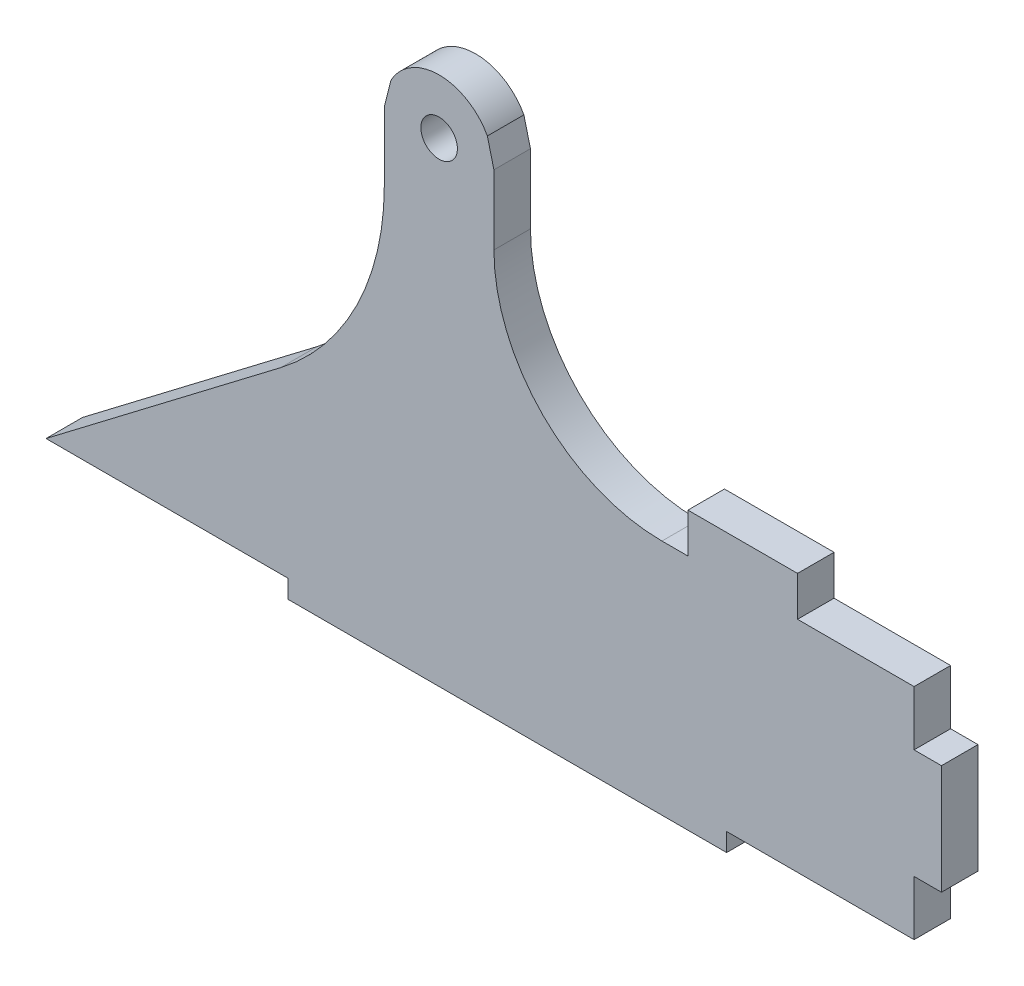
ISO-10303-21;
HEADER;
FILE_DESCRIPTION(('STEP AP214'),'2;1');
FILE_NAME('part.step','',(''),(''),'','','');
FILE_SCHEMA(('AUTOMOTIVE_DESIGN { 1 0 10303 214 1 1 1 1 }'));
ENDSEC;
DATA;
#1=APPLICATION_CONTEXT('core data for automotive mechanical design processes');
#2=APPLICATION_PROTOCOL_DEFINITION('international standard','automotive_design',2000,#1);
#3=PRODUCT_CONTEXT('',#1,'mechanical');
#4=PRODUCT('Part','Part','',(#3));
#5=PRODUCT_RELATED_PRODUCT_CATEGORY('part','',(#4));
#6=PRODUCT_DEFINITION_FORMATION('','',#4);
#7=PRODUCT_DEFINITION_CONTEXT('part definition',#1,'design');
#8=PRODUCT_DEFINITION('design','',#6,#7);
#9=PRODUCT_DEFINITION_SHAPE('','',#8);
#10=(LENGTH_UNIT() NAMED_UNIT(*) SI_UNIT(.MILLI.,.METRE.));
#11=(NAMED_UNIT(*) PLANE_ANGLE_UNIT() SI_UNIT($,.RADIAN.));
#12=(NAMED_UNIT(*) SI_UNIT($,.STERADIAN.) SOLID_ANGLE_UNIT());
#13=UNCERTAINTY_MEASURE_WITH_UNIT(LENGTH_MEASURE(1.E-05),#10,'distance_accuracy_value','');
#14=(GEOMETRIC_REPRESENTATION_CONTEXT(3) GLOBAL_UNCERTAINTY_ASSIGNED_CONTEXT((#13)) GLOBAL_UNIT_ASSIGNED_CONTEXT((#10,
#11,#12)) REPRESENTATION_CONTEXT('',''));
#15=CARTESIAN_POINT('',(0.,0.,0.));
#16=DIRECTION('',(0.,0.,1.));
#17=DIRECTION('',(1.,0.,0.));
#18=AXIS2_PLACEMENT_3D('',#15,#16,#17);
#19=CARTESIAN_POINT('',(0.,32.7786674301706,12.7));
#20=DIRECTION('',(0.,-1.,0.));
#21=DIRECTION('',(1.,0.,0.));
#22=AXIS2_PLACEMENT_3D('',#19,#20,#21);
#23=PLANE('',#22);
#24=DIRECTION('',(0.,0.,-1.));
#25=VECTOR('',#24,1.);
#26=CARTESIAN_POINT('',(89.2905230234754,32.7786674301706,12.7));
#27=LINE('',#26,#25);
#28=CARTESIAN_POINT('',(89.2905230234754,32.7786674301706,12.7));
#29=VERTEX_POINT('',#28);
#30=CARTESIAN_POINT('',(89.2905230234754,32.7786674301706,0.));
#31=VERTEX_POINT('',#30);
#32=EDGE_CURVE('E121',#29,#31,#27,.T.);
#33=ORIENTED_EDGE('',*,*,#32,.F.);
#34=DIRECTION('',(-1.,0.,0.));
#35=VECTOR('',#34,1.);
#36=CARTESIAN_POINT('',(0.,32.7786674301706,12.7));
#37=LINE('',#36,#35);
#38=CARTESIAN_POINT('',(129.803523023475,32.7786674301706,12.7));
#39=VERTEX_POINT('',#38);
#40=EDGE_CURVE('E364',#39,#29,#37,.T.);
#41=ORIENTED_EDGE('',*,*,#40,.F.);
#42=DIRECTION('',(0.,0.,-1.));
#43=VECTOR('',#42,1.);
#44=CARTESIAN_POINT('',(129.803523023475,32.7786674301706,12.7));
#45=LINE('',#44,#43);
#46=CARTESIAN_POINT('',(129.803523023475,32.7786674301706,0.));
#47=VERTEX_POINT('',#46);
#48=EDGE_CURVE('E235',#39,#47,#45,.T.);
#49=ORIENTED_EDGE('',*,*,#48,.T.);
#50=DIRECTION('',(-1.,0.,0.));
#51=VECTOR('',#50,1.);
#52=CARTESIAN_POINT('',(0.,32.7786674301706,0.));
#53=LINE('',#52,#51);
#54=EDGE_CURVE('E285',#47,#31,#53,.T.);
#55=ORIENTED_EDGE('',*,*,#54,.T.);
#56=EDGE_LOOP('',(#33,#41,#49,#55));
#57=FACE_BOUND('',#56,.T.);
#58=ADVANCED_FACE('F110',(#57),#23,.F.);
#59=CARTESIAN_POINT('',(-54.3464769765245,0.,12.7));
#60=DIRECTION('',(1.,0.,0.));
#61=DIRECTION('',(0.,1.,0.));
#62=AXIS2_PLACEMENT_3D('',#59,#60,#61);
#63=PLANE('',#62);
#64=DIRECTION('',(0.,-1.,0.));
#65=VECTOR('',#64,1.);
#66=CARTESIAN_POINT('',(-54.3464769765245,0.,0.));
#67=LINE('',#66,#65);
#68=CARTESIAN_POINT('',(-54.3464769765246,115.328667430171,0.));
#69=VERTEX_POINT('',#68);
#70=CARTESIAN_POINT('',(-54.3464769765246,91.4382890086782,0.));
#71=VERTEX_POINT('',#70);
#72=EDGE_CURVE('E337',#69,#71,#67,.T.);
#73=ORIENTED_EDGE('',*,*,#72,.T.);
#74=DIRECTION('',(0.,0.,-1.));
#75=VECTOR('',#74,1.);
#76=CARTESIAN_POINT('',(-54.3464769765246,91.4382890086782,12.7));
#77=LINE('',#76,#75);
#78=CARTESIAN_POINT('',(-54.3464769765246,91.4382890086782,12.7));
#79=VERTEX_POINT('',#78);
#80=EDGE_CURVE('E187',#79,#71,#77,.T.);
#81=ORIENTED_EDGE('',*,*,#80,.F.);
#82=DIRECTION('',(0.,-1.,0.));
#83=VECTOR('',#82,1.);
#84=CARTESIAN_POINT('',(-54.3464769765245,0.,12.7));
#85=LINE('',#84,#83);
#86=CARTESIAN_POINT('',(-54.3464769765246,115.328667430171,12.7));
#87=VERTEX_POINT('',#86);
#88=EDGE_CURVE('E417',#87,#79,#85,.T.);
#89=ORIENTED_EDGE('',*,*,#88,.F.);
#90=DIRECTION('',(0.,0.,-1.));
#91=VECTOR('',#90,1.);
#92=CARTESIAN_POINT('',(-54.3464769765246,115.328667430171,12.7));
#93=LINE('',#92,#91);
#94=EDGE_CURVE('E259',#87,#69,#93,.T.);
#95=ORIENTED_EDGE('',*,*,#94,.T.);
#96=EDGE_LOOP('',(#73,#81,#89,#95));
#97=FACE_BOUND('',#96,.T.);
#98=ADVANCED_FACE('F445',(#97),#63,.F.);
#99=CARTESIAN_POINT('',(-145.786476976525,91.4382890086777,12.7));
#100=DIRECTION('',(0.,0.,-1.));
#101=DIRECTION('',(-1.,0.,0.));
#102=AXIS2_PLACEMENT_3D('',#99,#100,#101);
#103=CYLINDRICAL_SURFACE('',#102,91.44);
#104=CARTESIAN_POINT('',(-145.786476976525,91.4382890086777,0.));
#105=DIRECTION('',(0.,0.,1.));
#106=DIRECTION('',(1.,0.,0.));
#107=AXIS2_PLACEMENT_3D('',#104,#105,#106);
#108=CIRCLE('',#107,91.44);
#109=CARTESIAN_POINT('',(-90.3866865866166,18.6912146705694,0.));
#110=VERTEX_POINT('',#109);
#111=EDGE_CURVE('E333',#71,#110,#108,.F.);
#112=ORIENTED_EDGE('',*,*,#111,.T.);
#113=DIRECTION('',(0.,0.,-1.));
#114=VECTOR('',#113,1.);
#115=CARTESIAN_POINT('',(-90.3866865866166,18.6912146705694,12.7));
#116=LINE('',#115,#114);
#117=CARTESIAN_POINT('',(-90.3866865866166,18.6912146705694,12.7));
#118=VERTEX_POINT('',#117);
#119=EDGE_CURVE('E191',#118,#110,#116,.T.);
#120=ORIENTED_EDGE('',*,*,#119,.F.);
#121=CARTESIAN_POINT('',(-145.786476976525,91.4382890086777,12.7));
#122=DIRECTION('',(0.,0.,1.));
#123=DIRECTION('',(1.,0.,0.));
#124=AXIS2_PLACEMENT_3D('',#121,#122,#123);
#125=CIRCLE('',#124,91.44);
#126=EDGE_CURVE('E413',#79,#118,#125,.F.);
#127=ORIENTED_EDGE('',*,*,#126,.F.);
#128=ORIENTED_EDGE('',*,*,#80,.T.);
#129=EDGE_LOOP('',(#112,#120,#127,#128));
#130=FACE_BOUND('',#129,.T.);
#131=ADVANCED_FACE('F447',(#130),#103,.F.);
#132=CARTESIAN_POINT('',(-42.187104883936,55.3971131208522,12.7));
#133=DIRECTION('',(0.605859474955253,-0.795571679113168,0.));
#134=DIRECTION('',(0.795571679113168,0.605859474955253,0.));
#135=AXIS2_PLACEMENT_3D('',#132,#133,#134);
#136=PLANE('',#135);
#137=DIRECTION('',(-0.795571679113168,-0.605859474955253,0.));
#138=VECTOR('',#137,1.);
#139=CARTESIAN_POINT('',(-42.187104883936,55.3971131208522,0.));
#140=LINE('',#139,#138);
#141=CARTESIAN_POINT('',(-171.948476976525,-43.4213325698294,0.));
#142=VERTEX_POINT('',#141);
#143=EDGE_CURVE('E329',#110,#142,#140,.T.);
#144=ORIENTED_EDGE('',*,*,#143,.T.);
#145=DIRECTION('',(0.,0.,-1.));
#146=VECTOR('',#145,1.);
#147=CARTESIAN_POINT('',(-171.948476976525,-43.4213325698294,12.7));
#148=LINE('',#147,#146);
#149=CARTESIAN_POINT('',(-171.948476976525,-43.4213325698294,12.7));
#150=VERTEX_POINT('',#149);
#151=EDGE_CURVE('E195',#150,#142,#148,.T.);
#152=ORIENTED_EDGE('',*,*,#151,.F.);
#153=DIRECTION('',(-0.795571679113168,-0.605859474955253,0.));
#154=VECTOR('',#153,1.);
#155=CARTESIAN_POINT('',(-42.187104883936,55.3971131208522,12.7));
#156=LINE('',#155,#154);
#157=EDGE_CURVE('E409',#118,#150,#156,.T.);
#158=ORIENTED_EDGE('',*,*,#157,.F.);
#159=ORIENTED_EDGE('',*,*,#119,.T.);
#160=EDGE_LOOP('',(#144,#152,#158,#159));
#161=FACE_BOUND('',#160,.T.);
#162=ADVANCED_FACE('F555',(#161),#136,.F.);
#163=CARTESIAN_POINT('',(0.,-43.4213325698294,12.7));
#164=DIRECTION('',(0.,1.,0.));
#165=DIRECTION('',(0.,0.,1.));
#166=AXIS2_PLACEMENT_3D('',#163,#164,#165);
#167=PLANE('',#166);
#168=DIRECTION('',(1.,0.,0.));
#169=VECTOR('',#168,1.);
#170=CARTESIAN_POINT('',(0.,-43.4213325698294,0.));
#171=LINE('',#170,#169);
#172=CARTESIAN_POINT('',(-87.7474769765246,-43.4213325698294,0.));
#173=VERTEX_POINT('',#172);
#174=EDGE_CURVE('E325',#142,#173,#171,.T.);
#175=ORIENTED_EDGE('',*,*,#174,.T.);
#176=DIRECTION('',(0.,0.,-1.));
#177=VECTOR('',#176,1.);
#178=CARTESIAN_POINT('',(-87.7474769765246,-43.4213325698294,12.7));
#179=LINE('',#178,#177);
#180=CARTESIAN_POINT('',(-87.7474769765246,-43.4213325698294,12.7));
#181=VERTEX_POINT('',#180);
#182=EDGE_CURVE('E199',#181,#173,#179,.T.);
#183=ORIENTED_EDGE('',*,*,#182,.F.);
#184=DIRECTION('',(1.,0.,0.));
#185=VECTOR('',#184,1.);
#186=CARTESIAN_POINT('',(0.,-43.4213325698294,12.7));
#187=LINE('',#186,#185);
#188=EDGE_CURVE('E405',#150,#181,#187,.T.);
#189=ORIENTED_EDGE('',*,*,#188,.F.);
#190=ORIENTED_EDGE('',*,*,#151,.T.);
#191=EDGE_LOOP('',(#175,#183,#189,#190));
#192=FACE_BOUND('',#191,.T.);
#193=ADVANCED_FACE('F558',(#192),#167,.F.);
#194=CARTESIAN_POINT('',(-87.7474769765246,0.,12.7));
#195=DIRECTION('',(1.,0.,0.));
#196=DIRECTION('',(0.,0.,-1.));
#197=AXIS2_PLACEMENT_3D('',#194,#195,#196);
#198=PLANE('',#197);
#199=DIRECTION('',(0.,-1.,0.));
#200=VECTOR('',#199,1.);
#201=CARTESIAN_POINT('',(-87.7474769765246,0.,0.));
#202=LINE('',#201,#200);
#203=CARTESIAN_POINT('',(-87.7474769765246,-49.7713325698294,0.));
#204=VERTEX_POINT('',#203);
#205=EDGE_CURVE('E321',#173,#204,#202,.T.);
#206=ORIENTED_EDGE('',*,*,#205,.T.);
#207=DIRECTION('',(0.,0.,-1.));
#208=VECTOR('',#207,1.);
#209=CARTESIAN_POINT('',(-87.7474769765246,-49.7713325698294,12.7));
#210=LINE('',#209,#208);
#211=CARTESIAN_POINT('',(-87.7474769765246,-49.7713325698294,12.7));
#212=VERTEX_POINT('',#211);
#213=EDGE_CURVE('E203',#212,#204,#210,.T.);
#214=ORIENTED_EDGE('',*,*,#213,.F.);
#215=DIRECTION('',(0.,-1.,0.));
#216=VECTOR('',#215,1.);
#217=CARTESIAN_POINT('',(-87.7474769765246,0.,12.7));
#218=LINE('',#217,#216);
#219=EDGE_CURVE('E401',#181,#212,#218,.T.);
#220=ORIENTED_EDGE('',*,*,#219,.F.);
#221=ORIENTED_EDGE('',*,*,#182,.T.);
#222=EDGE_LOOP('',(#206,#214,#220,#221));
#223=FACE_BOUND('',#222,.T.);
#224=ADVANCED_FACE('F562',(#223),#198,.F.);
#225=CARTESIAN_POINT('',(0.,-49.7713325698294,12.7));
#226=DIRECTION('',(0.,1.,0.));
#227=DIRECTION('',(-1.,0.,0.));
#228=AXIS2_PLACEMENT_3D('',#225,#226,#227);
#229=PLANE('',#228);
#230=DIRECTION('',(1.,0.,0.));
#231=VECTOR('',#230,1.);
#232=CARTESIAN_POINT('',(0.,-49.7713325698294,0.));
#233=LINE('',#232,#231);
#234=CARTESIAN_POINT('',(64.6525230234755,-49.7713325698294,0.));
#235=VERTEX_POINT('',#234);
#236=EDGE_CURVE('E317',#204,#235,#233,.T.);
#237=ORIENTED_EDGE('',*,*,#236,.T.);
#238=DIRECTION('',(0.,0.,-1.));
#239=VECTOR('',#238,1.);
#240=CARTESIAN_POINT('',(64.6525230234755,-49.7713325698294,12.7));
#241=LINE('',#240,#239);
#242=CARTESIAN_POINT('',(64.6525230234755,-49.7713325698294,12.7));
#243=VERTEX_POINT('',#242);
#244=EDGE_CURVE('E207',#243,#235,#241,.T.);
#245=ORIENTED_EDGE('',*,*,#244,.F.);
#246=DIRECTION('',(1.,0.,0.));
#247=VECTOR('',#246,1.);
#248=CARTESIAN_POINT('',(0.,-49.7713325698294,12.7));
#249=LINE('',#248,#247);
#250=EDGE_CURVE('E397',#212,#243,#249,.T.);
#251=ORIENTED_EDGE('',*,*,#250,.F.);
#252=ORIENTED_EDGE('',*,*,#213,.T.);
#253=EDGE_LOOP('',(#237,#245,#251,#252));
#254=FACE_BOUND('',#253,.T.);
#255=ADVANCED_FACE('F566',(#254),#229,.F.);
#256=CARTESIAN_POINT('',(64.6525230234755,0.,12.7));
#257=DIRECTION('',(-1.,0.,0.));
#258=DIRECTION('',(0.,0.,1.));
#259=AXIS2_PLACEMENT_3D('',#256,#257,#258);
#260=PLANE('',#259);
#261=DIRECTION('',(0.,1.,0.));
#262=VECTOR('',#261,1.);
#263=CARTESIAN_POINT('',(64.6525230234755,0.,0.));
#264=LINE('',#263,#262);
#265=CARTESIAN_POINT('',(64.6525230234755,-43.4213325698294,0.));
#266=VERTEX_POINT('',#265);
#267=EDGE_CURVE('E313',#235,#266,#264,.T.);
#268=ORIENTED_EDGE('',*,*,#267,.T.);
#269=DIRECTION('',(0.,0.,-1.));
#270=VECTOR('',#269,1.);
#271=CARTESIAN_POINT('',(64.6525230234755,-43.4213325698294,12.7));
#272=LINE('',#271,#270);
#273=CARTESIAN_POINT('',(64.6525230234755,-43.4213325698294,12.7));
#274=VERTEX_POINT('',#273);
#275=EDGE_CURVE('E211',#274,#266,#272,.T.);
#276=ORIENTED_EDGE('',*,*,#275,.F.);
#277=DIRECTION('',(0.,1.,0.));
#278=VECTOR('',#277,1.);
#279=CARTESIAN_POINT('',(64.6525230234755,0.,12.7));
#280=LINE('',#279,#278);
#281=EDGE_CURVE('E393',#243,#274,#280,.T.);
#282=ORIENTED_EDGE('',*,*,#281,.F.);
#283=ORIENTED_EDGE('',*,*,#244,.T.);
#284=EDGE_LOOP('',(#268,#276,#282,#283));
#285=FACE_BOUND('',#284,.T.);
#286=ADVANCED_FACE('F570',(#285),#260,.F.);
#287=CARTESIAN_POINT('',(0.,-43.4213325698294,12.7));
#288=DIRECTION('',(0.,1.,0.));
#289=DIRECTION('',(-1.,0.,0.));
#290=AXIS2_PLACEMENT_3D('',#287,#288,#289);
#291=PLANE('',#290);
#292=DIRECTION('',(1.,0.,0.));
#293=VECTOR('',#292,1.);
#294=CARTESIAN_POINT('',(0.,-43.4213325698294,0.));
#295=LINE('',#294,#293);
#296=CARTESIAN_POINT('',(129.803523023475,-43.4213325698294,0.));
#297=VERTEX_POINT('',#296);
#298=EDGE_CURVE('E309',#266,#297,#295,.T.);
#299=ORIENTED_EDGE('',*,*,#298,.T.);
#300=DIRECTION('',(0.,0.,-1.));
#301=VECTOR('',#300,1.);
#302=CARTESIAN_POINT('',(129.803523023475,-43.4213325698294,12.7));
#303=LINE('',#302,#301);
#304=CARTESIAN_POINT('',(129.803523023475,-43.4213325698294,12.7));
#305=VERTEX_POINT('',#304);
#306=EDGE_CURVE('E215',#305,#297,#303,.T.);
#307=ORIENTED_EDGE('',*,*,#306,.F.);
#308=DIRECTION('',(1.,0.,0.));
#309=VECTOR('',#308,1.);
#310=CARTESIAN_POINT('',(0.,-43.4213325698294,12.7));
#311=LINE('',#310,#309);
#312=EDGE_CURVE('E389',#274,#305,#311,.T.);
#313=ORIENTED_EDGE('',*,*,#312,.F.);
#314=ORIENTED_EDGE('',*,*,#275,.T.);
#315=EDGE_LOOP('',(#299,#307,#313,#314));
#316=FACE_BOUND('',#315,.T.);
#317=ADVANCED_FACE('F574',(#316),#291,.F.);
#318=CARTESIAN_POINT('',(129.803523023475,0.,12.7));
#319=DIRECTION('',(-1.,0.,0.));
#320=DIRECTION('',(0.,0.,1.));
#321=AXIS2_PLACEMENT_3D('',#318,#319,#320);
#322=PLANE('',#321);
#323=DIRECTION('',(0.,1.,0.));
#324=VECTOR('',#323,1.);
#325=CARTESIAN_POINT('',(129.803523023475,0.,0.));
#326=LINE('',#325,#324);
#327=CARTESIAN_POINT('',(129.803523023475,-24.3713325698294,0.));
#328=VERTEX_POINT('',#327);
#329=EDGE_CURVE('E305',#297,#328,#326,.T.);
#330=ORIENTED_EDGE('',*,*,#329,.T.);
#331=DIRECTION('',(0.,0.,-1.));
#332=VECTOR('',#331,1.);
#333=CARTESIAN_POINT('',(129.803523023475,-24.3713325698294,12.7));
#334=LINE('',#333,#332);
#335=CARTESIAN_POINT('',(129.803523023475,-24.3713325698294,12.7));
#336=VERTEX_POINT('',#335);
#337=EDGE_CURVE('E219',#336,#328,#334,.T.);
#338=ORIENTED_EDGE('',*,*,#337,.F.);
#339=DIRECTION('',(0.,1.,0.));
#340=VECTOR('',#339,1.);
#341=CARTESIAN_POINT('',(129.803523023475,0.,12.7));
#342=LINE('',#341,#340);
#343=EDGE_CURVE('E385',#305,#336,#342,.T.);
#344=ORIENTED_EDGE('',*,*,#343,.F.);
#345=ORIENTED_EDGE('',*,*,#306,.T.);
#346=EDGE_LOOP('',(#330,#338,#344,#345));
#347=FACE_BOUND('',#346,.T.);
#348=ADVANCED_FACE('F578',(#347),#322,.F.);
#349=CARTESIAN_POINT('',(0.,-24.3713325698294,12.7));
#350=DIRECTION('',(0.,-1.,0.));
#351=DIRECTION('',(0.,0.,-1.));
#352=AXIS2_PLACEMENT_3D('',#349,#350,#351);
#353=PLANE('',#352);
#354=DIRECTION('',(-1.,0.,0.));
#355=VECTOR('',#354,1.);
#356=CARTESIAN_POINT('',(0.,-24.3713325698294,0.));
#357=LINE('',#356,#355);
#358=CARTESIAN_POINT('',(139.328523023475,-24.3713325698294,0.));
#359=VERTEX_POINT('',#358);
#360=EDGE_CURVE('E301',#359,#328,#357,.T.);
#361=ORIENTED_EDGE('',*,*,#360,.F.);
#362=DIRECTION('',(0.,0.,-1.));
#363=VECTOR('',#362,1.);
#364=CARTESIAN_POINT('',(139.328523023475,-24.3713325698294,12.7));
#365=LINE('',#364,#363);
#366=CARTESIAN_POINT('',(139.328523023475,-24.3713325698294,12.7));
#367=VERTEX_POINT('',#366);
#368=EDGE_CURVE('E223',#367,#359,#365,.T.);
#369=ORIENTED_EDGE('',*,*,#368,.F.);
#370=DIRECTION('',(-1.,0.,0.));
#371=VECTOR('',#370,1.);
#372=CARTESIAN_POINT('',(0.,-24.3713325698294,12.7));
#373=LINE('',#372,#371);
#374=EDGE_CURVE('E381',#367,#336,#373,.T.);
#375=ORIENTED_EDGE('',*,*,#374,.T.);
#376=ORIENTED_EDGE('',*,*,#337,.T.);
#377=EDGE_LOOP('',(#361,#369,#375,#376));
#378=FACE_BOUND('',#377,.T.);
#379=ADVANCED_FACE('F582',(#378),#353,.T.);
#380=CARTESIAN_POINT('',(139.328523023475,0.,12.7));
#381=DIRECTION('',(1.,0.,0.));
#382=DIRECTION('',(0.,0.,-1.));
#383=AXIS2_PLACEMENT_3D('',#380,#381,#382);
#384=PLANE('',#383);
#385=DIRECTION('',(0.,-1.,0.));
#386=VECTOR('',#385,1.);
#387=CARTESIAN_POINT('',(139.328523023475,0.,0.));
#388=LINE('',#387,#386);
#389=CARTESIAN_POINT('',(139.328523023475,13.7286674301706,0.));
#390=VERTEX_POINT('',#389);
#391=EDGE_CURVE('E297',#390,#359,#388,.T.);
#392=ORIENTED_EDGE('',*,*,#391,.F.);
#393=DIRECTION('',(0.,0.,-1.));
#394=VECTOR('',#393,1.);
#395=CARTESIAN_POINT('',(139.328523023475,13.7286674301706,12.7));
#396=LINE('',#395,#394);
#397=CARTESIAN_POINT('',(139.328523023475,13.7286674301706,12.7));
#398=VERTEX_POINT('',#397);
#399=EDGE_CURVE('E227',#398,#390,#396,.T.);
#400=ORIENTED_EDGE('',*,*,#399,.F.);
#401=DIRECTION('',(0.,-1.,0.));
#402=VECTOR('',#401,1.);
#403=CARTESIAN_POINT('',(139.328523023475,0.,12.7));
#404=LINE('',#403,#402);
#405=EDGE_CURVE('E377',#398,#367,#404,.T.);
#406=ORIENTED_EDGE('',*,*,#405,.T.);
#407=ORIENTED_EDGE('',*,*,#368,.T.);
#408=EDGE_LOOP('',(#392,#400,#406,#407));
#409=FACE_BOUND('',#408,.T.);
#410=ADVANCED_FACE('F586',(#409),#384,.T.);
#411=CARTESIAN_POINT('',(0.,13.7286674301706,12.7));
#412=DIRECTION('',(0.,1.,0.));
#413=DIRECTION('',(0.,0.,1.));
#414=AXIS2_PLACEMENT_3D('',#411,#412,#413);
#415=PLANE('',#414);
#416=DIRECTION('',(1.,0.,0.));
#417=VECTOR('',#416,1.);
#418=CARTESIAN_POINT('',(0.,13.7286674301706,0.));
#419=LINE('',#418,#417);
#420=CARTESIAN_POINT('',(129.803523023475,13.7286674301706,0.));
#421=VERTEX_POINT('',#420);
#422=EDGE_CURVE('E293',#421,#390,#419,.T.);
#423=ORIENTED_EDGE('',*,*,#422,.F.);
#424=DIRECTION('',(0.,0.,-1.));
#425=VECTOR('',#424,1.);
#426=CARTESIAN_POINT('',(129.803523023475,13.7286674301706,12.7));
#427=LINE('',#426,#425);
#428=CARTESIAN_POINT('',(129.803523023475,13.7286674301706,12.7));
#429=VERTEX_POINT('',#428);
#430=EDGE_CURVE('E231',#429,#421,#427,.T.);
#431=ORIENTED_EDGE('',*,*,#430,.F.);
#432=DIRECTION('',(1.,0.,0.));
#433=VECTOR('',#432,1.);
#434=CARTESIAN_POINT('',(0.,13.7286674301706,12.7));
#435=LINE('',#434,#433);
#436=EDGE_CURVE('E373',#429,#398,#435,.T.);
#437=ORIENTED_EDGE('',*,*,#436,.T.);
#438=ORIENTED_EDGE('',*,*,#399,.T.);
#439=EDGE_LOOP('',(#423,#431,#437,#438));
#440=FACE_BOUND('',#439,.T.);
#441=ADVANCED_FACE('F590',(#440),#415,.T.);
#442=CARTESIAN_POINT('',(129.803523023475,-1.89121863435858E-13,12.7));
#443=DIRECTION('',(-1.,0.,0.));
#444=DIRECTION('',(0.,-1.,0.));
#445=AXIS2_PLACEMENT_3D('',#442,#443,#444);
#446=PLANE('',#445);
#447=DIRECTION('',(0.,1.,0.));
#448=VECTOR('',#447,1.);
#449=CARTESIAN_POINT('',(129.803523023475,-1.89121863435858E-13,0.));
#450=LINE('',#449,#448);
#451=EDGE_CURVE('E289',#421,#47,#450,.T.);
#452=ORIENTED_EDGE('',*,*,#451,.T.);
#453=ORIENTED_EDGE('',*,*,#48,.F.);
#454=DIRECTION('',(0.,1.,0.));
#455=VECTOR('',#454,1.);
#456=CARTESIAN_POINT('',(129.803523023475,-1.89121863435858E-13,12.7));
#457=LINE('',#456,#455);
#458=EDGE_CURVE('E369',#429,#39,#457,.T.);
#459=ORIENTED_EDGE('',*,*,#458,.F.);
#460=ORIENTED_EDGE('',*,*,#430,.T.);
#461=EDGE_LOOP('',(#452,#453,#459,#460));
#462=FACE_BOUND('',#461,.T.);
#463=ADVANCED_FACE('F594',(#462),#446,.F.);
#464=CARTESIAN_POINT('',(51.1905230234754,32.7786674301706,12.7));
#465=VERTEX_POINT('',#464);
#466=CARTESIAN_POINT('',(42.1735230234758,32.7786674301706,12.7));
#467=VERTEX_POINT('',#466);
#468=EDGE_CURVE('E368',#465,#467,#37,.T.);
#469=ORIENTED_EDGE('',*,*,#468,.F.);
#470=DIRECTION('',(0.,0.,-1.));
#471=VECTOR('',#470,1.);
#472=CARTESIAN_POINT('',(51.1905230234754,32.7786674301706,12.7));
#473=LINE('',#472,#471);
#474=CARTESIAN_POINT('',(51.1905230234754,32.7786674301706,0.));
#475=VERTEX_POINT('',#474);
#476=EDGE_CURVE('E12',#465,#475,#473,.T.);
#477=ORIENTED_EDGE('',*,*,#476,.T.);
#478=CARTESIAN_POINT('',(42.1735230234758,32.7786674301706,0.));
#479=VERTEX_POINT('',#478);
#480=EDGE_CURVE('E288',#475,#479,#53,.T.);
#481=ORIENTED_EDGE('',*,*,#480,.T.);
#482=DIRECTION('',(0.,0.,-1.));
#483=VECTOR('',#482,1.);
#484=CARTESIAN_POINT('',(42.1735230234758,32.7786674301706,12.7));
#485=LINE('',#484,#483);
#486=EDGE_CURVE('E239',#467,#479,#485,.T.);
#487=ORIENTED_EDGE('',*,*,#486,.F.);
#488=EDGE_LOOP('',(#469,#477,#481,#487));
#489=FACE_BOUND('',#488,.T.);
#490=ADVANCED_FACE('F492',(#489),#23,.F.);
#491=CARTESIAN_POINT('',(42.1735230234754,91.1986674301706,12.7));
#492=DIRECTION('',(0.,0.,-1.));
#493=DIRECTION('',(-1.,0.,0.));
#494=AXIS2_PLACEMENT_3D('',#491,#492,#493);
#495=CYLINDRICAL_SURFACE('',#494,58.42);
#496=CARTESIAN_POINT('',(42.1735230234754,91.1986674301706,0.));
#497=DIRECTION('',(0.,0.,1.));
#498=DIRECTION('',(1.,0.,0.));
#499=AXIS2_PLACEMENT_3D('',#496,#497,#498);
#500=CIRCLE('',#499,58.42);
#501=CARTESIAN_POINT('',(-16.2464769765246,91.198667430171,0.));
#502=VERTEX_POINT('',#501);
#503=EDGE_CURVE('E281',#479,#502,#500,.F.);
#504=ORIENTED_EDGE('',*,*,#503,.T.);
#505=DIRECTION('',(0.,0.,-1.));
#506=VECTOR('',#505,1.);
#507=CARTESIAN_POINT('',(-16.2464769765246,91.198667430171,12.7));
#508=LINE('',#507,#506);
#509=CARTESIAN_POINT('',(-16.2464769765246,91.198667430171,12.7));
#510=VERTEX_POINT('',#509);
#511=EDGE_CURVE('E243',#510,#502,#508,.T.);
#512=ORIENTED_EDGE('',*,*,#511,.F.);
#513=CARTESIAN_POINT('',(42.1735230234754,91.1986674301706,12.7));
#514=DIRECTION('',(0.,0.,1.));
#515=DIRECTION('',(1.,0.,0.));
#516=AXIS2_PLACEMENT_3D('',#513,#514,#515);
#517=CIRCLE('',#516,58.42);
#518=EDGE_CURVE('E360',#467,#510,#517,.F.);
#519=ORIENTED_EDGE('',*,*,#518,.F.);
#520=ORIENTED_EDGE('',*,*,#486,.T.);
#521=EDGE_LOOP('',(#504,#512,#519,#520));
#522=FACE_BOUND('',#521,.T.);
#523=ADVANCED_FACE('F503',(#522),#495,.F.);
#524=CARTESIAN_POINT('',(-16.2464769765246,0.,12.7));
#525=DIRECTION('',(-1.,0.,0.));
#526=DIRECTION('',(0.,0.,1.));
#527=AXIS2_PLACEMENT_3D('',#524,#525,#526);
#528=PLANE('',#527);
#529=DIRECTION('',(0.,1.,0.));
#530=VECTOR('',#529,1.);
#531=CARTESIAN_POINT('',(-16.2464769765246,0.,0.));
#532=LINE('',#531,#530);
#533=CARTESIAN_POINT('',(-16.2464769765246,115.328667430171,0.));
#534=VERTEX_POINT('',#533);
#535=EDGE_CURVE('E277',#502,#534,#532,.T.);
#536=ORIENTED_EDGE('',*,*,#535,.T.);
#537=DIRECTION('',(0.,0.,-1.));
#538=VECTOR('',#537,1.);
#539=CARTESIAN_POINT('',(-16.2464769765246,115.328667430171,12.7));
#540=LINE('',#539,#538);
#541=CARTESIAN_POINT('',(-16.2464769765246,115.328667430171,12.7));
#542=VERTEX_POINT('',#541);
#543=EDGE_CURVE('E247',#542,#534,#540,.T.);
#544=ORIENTED_EDGE('',*,*,#543,.F.);
#545=DIRECTION('',(0.,1.,0.));
#546=VECTOR('',#545,1.);
#547=CARTESIAN_POINT('',(-16.2464769765246,0.,12.7));
#548=LINE('',#547,#546);
#549=EDGE_CURVE('E356',#510,#542,#548,.T.);
#550=ORIENTED_EDGE('',*,*,#549,.F.);
#551=ORIENTED_EDGE('',*,*,#511,.T.);
#552=EDGE_LOOP('',(#536,#544,#550,#551));
#553=FACE_BOUND('',#552,.T.);
#554=ADVANCED_FACE('F508',(#553),#528,.F.);
#555=CARTESIAN_POINT('',(12.0911043060892,3.05167280450195,12.7));
#556=DIRECTION('',(-0.969594813281753,-0.244715953826314,0.));
#557=DIRECTION('',(0.244715953826314,-0.969594813281753,0.));
#558=AXIS2_PLACEMENT_3D('',#555,#556,#557);
#559=PLANE('',#558);
#560=DIRECTION('',(-0.244715953826314,0.969594813281753,0.));
#561=VECTOR('',#560,1.);
#562=CARTESIAN_POINT('',(12.0911043060892,3.05167280450195,0.));
#563=LINE('',#562,#561);
#564=CARTESIAN_POINT('',(-18.528129692501,124.368857105303,0.));
#565=VERTEX_POINT('',#564);
#566=EDGE_CURVE('E273',#534,#565,#563,.T.);
#567=ORIENTED_EDGE('',*,*,#566,.T.);
#568=DIRECTION('',(0.,0.,-1.));
#569=VECTOR('',#568,1.);
#570=CARTESIAN_POINT('',(-18.528129692501,124.368857105303,12.7));
#571=LINE('',#570,#569);
#572=CARTESIAN_POINT('',(-18.528129692501,124.368857105303,12.7));
#573=VERTEX_POINT('',#572);
#574=EDGE_CURVE('E251',#573,#565,#571,.T.);
#575=ORIENTED_EDGE('',*,*,#574,.F.);
#576=DIRECTION('',(-0.244715953826314,0.969594813281753,0.));
#577=VECTOR('',#576,1.);
#578=CARTESIAN_POINT('',(12.0911043060892,3.05167280450195,12.7));
#579=LINE('',#578,#577);
#580=EDGE_CURVE('E352',#542,#573,#579,.T.);
#581=ORIENTED_EDGE('',*,*,#580,.F.);
#582=ORIENTED_EDGE('',*,*,#543,.T.);
#583=EDGE_LOOP('',(#567,#575,#581,#582));
#584=FACE_BOUND('',#583,.T.);
#585=ADVANCED_FACE('F528',(#584),#559,.F.);
#586=CARTESIAN_POINT('',(-35.2964769765246,115.328667430171,12.7));
#587=DIRECTION('',(0.,0.,-1.));
#588=DIRECTION('',(-1.,0.,0.));
#589=AXIS2_PLACEMENT_3D('',#586,#587,#588);
#590=CYLINDRICAL_SURFACE('',#589,19.05);
#591=CARTESIAN_POINT('',(-35.2964769765246,115.328667430171,0.));
#592=DIRECTION('',(0.,0.,1.));
#593=DIRECTION('',(1.,0.,0.));
#594=AXIS2_PLACEMENT_3D('',#591,#592,#593);
#595=CIRCLE('',#594,19.05);
#596=CARTESIAN_POINT('',(-52.0648242605482,124.368857105303,0.));
#597=VERTEX_POINT('',#596);
#598=EDGE_CURVE('E269',#565,#597,#595,.T.);
#599=ORIENTED_EDGE('',*,*,#598,.T.);
#600=DIRECTION('',(0.,0.,-1.));
#601=VECTOR('',#600,1.);
#602=CARTESIAN_POINT('',(-52.0648242605482,124.368857105303,12.7));
#603=LINE('',#602,#601);
#604=CARTESIAN_POINT('',(-52.0648242605482,124.368857105303,12.7));
#605=VERTEX_POINT('',#604);
#606=EDGE_CURVE('E255',#605,#597,#603,.T.);
#607=ORIENTED_EDGE('',*,*,#606,.F.);
#608=CARTESIAN_POINT('',(-35.2964769765246,115.328667430171,12.7));
#609=DIRECTION('',(0.,0.,1.));
#610=DIRECTION('',(1.,0.,0.));
#611=AXIS2_PLACEMENT_3D('',#608,#609,#610);
#612=CIRCLE('',#611,19.05);
#613=EDGE_CURVE('E348',#573,#605,#612,.T.);
#614=ORIENTED_EDGE('',*,*,#613,.F.);
#615=ORIENTED_EDGE('',*,*,#574,.T.);
#616=EDGE_LOOP('',(#599,#607,#614,#615));
#617=FACE_BOUND('',#616,.T.);
#618=ADVANCED_FACE('F523',(#617),#590,.T.);
#619=CARTESIAN_POINT('',(-35.2964769765246,115.328667430171,12.7));
#620=DIRECTION('',(0.,0.,-1.));
#621=DIRECTION('',(-1.,0.,0.));
#622=AXIS2_PLACEMENT_3D('',#619,#620,#621);
#623=CYLINDRICAL_SURFACE('',#622,6.34999999999997);
#624=CARTESIAN_POINT('',(-35.2964769765246,115.328667430171,12.7));
#625=DIRECTION('',(0.,0.,1.));
#626=DIRECTION('',(1.,0.,0.));
#627=AXIS2_PLACEMENT_3D('',#624,#625,#626);
#628=CIRCLE('',#627,6.34999999999997);
#629=CARTESIAN_POINT('',(-28.9464769765247,115.328667430171,12.7));
#630=VERTEX_POINT('',#629);
#631=EDGE_CURVE('E268',#630,#630,#628,.T.);
#632=ORIENTED_EDGE('',*,*,#631,.T.);
#633=EDGE_LOOP('',(#632));
#634=FACE_BOUND('',#633,.T.);
#635=CARTESIAN_POINT('',(-35.2964769765246,115.328667430171,0.));
#636=DIRECTION('',(0.,0.,1.));
#637=DIRECTION('',(1.,0.,0.));
#638=AXIS2_PLACEMENT_3D('',#635,#636,#637);
#639=CIRCLE('',#638,6.34999999999997);
#640=CARTESIAN_POINT('',(-28.9464769765247,115.328667430171,0.));
#641=VERTEX_POINT('',#640);
#642=EDGE_CURVE('E341',#641,#641,#639,.T.);
#643=ORIENTED_EDGE('',*,*,#642,.F.);
#644=EDGE_LOOP('',(#643));
#645=FACE_BOUND('',#644,.T.);
#646=ADVANCED_FACE('F425',(#634,#645),#623,.F.);
#647=CARTESIAN_POINT('',(-78.4565358151549,19.8016385122048,12.7));
#648=DIRECTION('',(0.969594813281753,-0.244715953826313,0.));
#649=DIRECTION('',(0.244715953826313,0.969594813281753,0.));
#650=AXIS2_PLACEMENT_3D('',#647,#648,#649);
#651=PLANE('',#650);
#652=DIRECTION('',(-0.244715953826313,-0.969594813281753,0.));
#653=VECTOR('',#652,1.);
#654=CARTESIAN_POINT('',(-78.4565358151549,19.8016385122048,0.));
#655=LINE('',#654,#653);
#656=EDGE_CURVE('E264',#597,#69,#655,.T.);
#657=ORIENTED_EDGE('',*,*,#656,.T.);
#658=ORIENTED_EDGE('',*,*,#94,.F.);
#659=DIRECTION('',(-0.244715953826313,-0.969594813281753,0.));
#660=VECTOR('',#659,1.);
#661=CARTESIAN_POINT('',(-78.4565358151549,19.8016385122048,12.7));
#662=LINE('',#661,#660);
#663=EDGE_CURVE('E263',#605,#87,#662,.T.);
#664=ORIENTED_EDGE('',*,*,#663,.F.);
#665=ORIENTED_EDGE('',*,*,#606,.T.);
#666=EDGE_LOOP('',(#657,#658,#664,#665));
#667=FACE_BOUND('',#666,.T.);
#668=ADVANCED_FACE('F431',(#667),#651,.F.);
#669=CARTESIAN_POINT('',(0.,0.,12.7));
#670=DIRECTION('',(0.,0.,1.));
#671=DIRECTION('',(1.,0.,0.));
#672=AXIS2_PLACEMENT_3D('',#669,#670,#671);
#673=PLANE('',#672);
#674=ORIENTED_EDGE('',*,*,#631,.F.);
#675=EDGE_LOOP('',(#674));
#676=FACE_BOUND('',#675,.T.);
#677=ORIENTED_EDGE('',*,*,#88,.T.);
#678=ORIENTED_EDGE('',*,*,#126,.T.);
#679=ORIENTED_EDGE('',*,*,#157,.T.);
#680=ORIENTED_EDGE('',*,*,#188,.T.);
#681=ORIENTED_EDGE('',*,*,#219,.T.);
#682=ORIENTED_EDGE('',*,*,#250,.T.);
#683=ORIENTED_EDGE('',*,*,#281,.T.);
#684=ORIENTED_EDGE('',*,*,#312,.T.);
#685=ORIENTED_EDGE('',*,*,#343,.T.);
#686=ORIENTED_EDGE('',*,*,#374,.F.);
#687=ORIENTED_EDGE('',*,*,#405,.F.);
#688=ORIENTED_EDGE('',*,*,#436,.F.);
#689=ORIENTED_EDGE('',*,*,#458,.T.);
#690=ORIENTED_EDGE('',*,*,#40,.T.);
#691=DIRECTION('',(0.,1.,0.));
#692=VECTOR('',#691,1.);
#693=CARTESIAN_POINT('',(89.2905230234754,32.7786674301706,12.7));
#694=LINE('',#693,#692);
#695=CARTESIAN_POINT('',(89.2905230234754,46.5975395220214,12.7));
#696=VERTEX_POINT('',#695);
#697=EDGE_CURVE('E169',#29,#696,#694,.T.);
#698=ORIENTED_EDGE('',*,*,#697,.T.);
#699=DIRECTION('',(-1.,0.,0.));
#700=VECTOR('',#699,1.);
#701=CARTESIAN_POINT('',(89.2905230234754,46.5975395220214,12.7));
#702=LINE('',#701,#700);
#703=CARTESIAN_POINT('',(51.1905230234754,46.5975395220214,12.7));
#704=VERTEX_POINT('',#703);
#705=EDGE_CURVE('E162',#696,#704,#702,.T.);
#706=ORIENTED_EDGE('',*,*,#705,.T.);
#707=DIRECTION('',(0.,1.,0.));
#708=VECTOR('',#707,1.);
#709=CARTESIAN_POINT('',(51.1905230234754,32.7786674301706,12.7));
#710=LINE('',#709,#708);
#711=EDGE_CURVE('E180',#465,#704,#710,.T.);
#712=ORIENTED_EDGE('',*,*,#711,.F.);
#713=ORIENTED_EDGE('',*,*,#468,.T.);
#714=ORIENTED_EDGE('',*,*,#518,.T.);
#715=ORIENTED_EDGE('',*,*,#549,.T.);
#716=ORIENTED_EDGE('',*,*,#580,.T.);
#717=ORIENTED_EDGE('',*,*,#613,.T.);
#718=ORIENTED_EDGE('',*,*,#663,.T.);
#719=EDGE_LOOP('',(#677,#678,#679,#680,#681,#682,#683,#684,#685,#686,#687,#688,#689,#690,#698,
#706,#712,#713,#714,#715,#716,#717,#718));
#720=FACE_BOUND('',#719,.T.);
#721=ADVANCED_FACE('F428',(#676,#720),#673,.T.);
#722=CARTESIAN_POINT('',(0.,0.,0.));
#723=DIRECTION('',(0.,0.,1.));
#724=DIRECTION('',(1.,0.,0.));
#725=AXIS2_PLACEMENT_3D('',#722,#723,#724);
#726=PLANE('',#725);
#727=ORIENTED_EDGE('',*,*,#642,.T.);
#728=EDGE_LOOP('',(#727));
#729=FACE_BOUND('',#728,.T.);
#730=ORIENTED_EDGE('',*,*,#72,.F.);
#731=ORIENTED_EDGE('',*,*,#656,.F.);
#732=ORIENTED_EDGE('',*,*,#598,.F.);
#733=ORIENTED_EDGE('',*,*,#566,.F.);
#734=ORIENTED_EDGE('',*,*,#535,.F.);
#735=ORIENTED_EDGE('',*,*,#503,.F.);
#736=ORIENTED_EDGE('',*,*,#480,.F.);
#737=DIRECTION('',(0.,1.,0.));
#738=VECTOR('',#737,1.);
#739=CARTESIAN_POINT('',(51.1905230234754,32.7786674301706,0.));
#740=LINE('',#739,#738);
#741=CARTESIAN_POINT('',(51.1905230234754,46.5975395220214,0.));
#742=VERTEX_POINT('',#741);
#743=EDGE_CURVE('E163',#475,#742,#740,.T.);
#744=ORIENTED_EDGE('',*,*,#743,.T.);
#745=DIRECTION('',(-1.,0.,0.));
#746=VECTOR('',#745,1.);
#747=CARTESIAN_POINT('',(89.2905230234754,46.5975395220214,0.));
#748=LINE('',#747,#746);
#749=CARTESIAN_POINT('',(89.2905230234754,46.5975395220214,0.));
#750=VERTEX_POINT('',#749);
#751=EDGE_CURVE('E166',#750,#742,#748,.T.);
#752=ORIENTED_EDGE('',*,*,#751,.F.);
#753=DIRECTION('',(0.,1.,0.));
#754=VECTOR('',#753,1.);
#755=CARTESIAN_POINT('',(89.2905230234754,32.7786674301706,0.));
#756=LINE('',#755,#754);
#757=EDGE_CURVE('E150',#31,#750,#756,.T.);
#758=ORIENTED_EDGE('',*,*,#757,.F.);
#759=ORIENTED_EDGE('',*,*,#54,.F.);
#760=ORIENTED_EDGE('',*,*,#451,.F.);
#761=ORIENTED_EDGE('',*,*,#422,.T.);
#762=ORIENTED_EDGE('',*,*,#391,.T.);
#763=ORIENTED_EDGE('',*,*,#360,.T.);
#764=ORIENTED_EDGE('',*,*,#329,.F.);
#765=ORIENTED_EDGE('',*,*,#298,.F.);
#766=ORIENTED_EDGE('',*,*,#267,.F.);
#767=ORIENTED_EDGE('',*,*,#236,.F.);
#768=ORIENTED_EDGE('',*,*,#205,.F.);
#769=ORIENTED_EDGE('',*,*,#174,.F.);
#770=ORIENTED_EDGE('',*,*,#143,.F.);
#771=ORIENTED_EDGE('',*,*,#111,.F.);
#772=EDGE_LOOP('',(#730,#731,#732,#733,#734,#735,#736,#744,#752,#758,#759,#760,#761,#762,#763,
#764,#765,#766,#767,#768,#769,#770,#771));
#773=FACE_BOUND('',#772,.T.);
#774=ADVANCED_FACE('F171',(#729,#773),#726,.F.);
#775=CARTESIAN_POINT('',(51.1905230234754,32.7786674301706,12.7));
#776=DIRECTION('',(-1.,0.,0.));
#777=DIRECTION('',(0.,0.,1.));
#778=AXIS2_PLACEMENT_3D('',#775,#776,#777);
#779=PLANE('',#778);
#780=ORIENTED_EDGE('',*,*,#743,.F.);
#781=ORIENTED_EDGE('',*,*,#476,.F.);
#782=ORIENTED_EDGE('',*,*,#711,.T.);
#783=DIRECTION('',(0.,0.,-1.));
#784=VECTOR('',#783,1.);
#785=CARTESIAN_POINT('',(51.1905230234754,46.5975395220214,12.7));
#786=LINE('',#785,#784);
#787=EDGE_CURVE('E114',#704,#742,#786,.T.);
#788=ORIENTED_EDGE('',*,*,#787,.T.);
#789=EDGE_LOOP('',(#780,#781,#782,#788));
#790=FACE_BOUND('',#789,.T.);
#791=ADVANCED_FACE('F495',(#790),#779,.T.);
#792=CARTESIAN_POINT('',(89.2905230234754,32.7786674301706,12.7));
#793=DIRECTION('',(-1.,0.,0.));
#794=DIRECTION('',(0.,0.,1.));
#795=AXIS2_PLACEMENT_3D('',#792,#793,#794);
#796=PLANE('',#795);
#797=ORIENTED_EDGE('',*,*,#757,.T.);
#798=DIRECTION('',(0.,0.,-1.));
#799=VECTOR('',#798,1.);
#800=CARTESIAN_POINT('',(89.2905230234754,46.5975395220214,12.7));
#801=LINE('',#800,#799);
#802=EDGE_CURVE('E154',#696,#750,#801,.T.);
#803=ORIENTED_EDGE('',*,*,#802,.F.);
#804=ORIENTED_EDGE('',*,*,#697,.F.);
#805=ORIENTED_EDGE('',*,*,#32,.T.);
#806=EDGE_LOOP('',(#797,#803,#804,#805));
#807=FACE_BOUND('',#806,.T.);
#808=ADVANCED_FACE('F152',(#807),#796,.F.);
#809=CARTESIAN_POINT('',(89.2905230234754,46.5975395220214,12.7));
#810=DIRECTION('',(0.,-1.,0.));
#811=DIRECTION('',(0.,0.,-1.));
#812=AXIS2_PLACEMENT_3D('',#809,#810,#811);
#813=PLANE('',#812);
#814=ORIENTED_EDGE('',*,*,#751,.T.);
#815=ORIENTED_EDGE('',*,*,#787,.F.);
#816=ORIENTED_EDGE('',*,*,#705,.F.);
#817=ORIENTED_EDGE('',*,*,#802,.T.);
#818=EDGE_LOOP('',(#814,#815,#816,#817));
#819=FACE_BOUND('',#818,.T.);
#820=ADVANCED_FACE('F112',(#819),#813,.F.);
#821=CLOSED_SHELL('',(#58,#98,#131,#162,#193,#224,#255,#286,#317,#348,#379,#410,#441,#463,#490,
#523,#554,#585,#618,#646,#668,#721,#774,#791,#808,#820));
#822=MANIFOLD_SOLID_BREP('B2',#821);
#823=ADVANCED_BREP_SHAPE_REPRESENTATION('',(#18,#822),#14);
#824=SHAPE_DEFINITION_REPRESENTATION(#9,#823);
ENDSEC;
END-ISO-10303-21;
